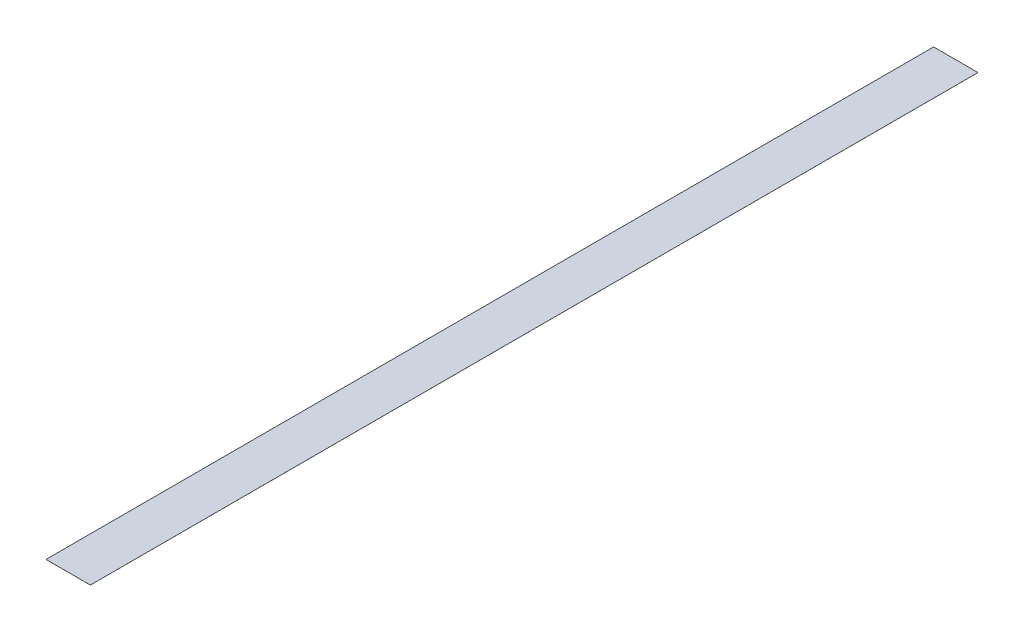
ISO-10303-21;
HEADER;
FILE_DESCRIPTION(('STEP AP214'),'2;1');
FILE_NAME('part.step','',(''),(''),'','','');
FILE_SCHEMA(('AUTOMOTIVE_DESIGN { 1 0 10303 214 1 1 1 1 }'));
ENDSEC;
DATA;
#1=APPLICATION_CONTEXT('core data for automotive mechanical design processes');
#2=APPLICATION_PROTOCOL_DEFINITION('international standard','automotive_design',2000,#1);
#3=PRODUCT_CONTEXT('',#1,'mechanical');
#4=PRODUCT('Part','Part','',(#3));
#5=PRODUCT_RELATED_PRODUCT_CATEGORY('part','',(#4));
#6=PRODUCT_DEFINITION_FORMATION('','',#4);
#7=PRODUCT_DEFINITION_CONTEXT('part definition',#1,'design');
#8=PRODUCT_DEFINITION('design','',#6,#7);
#9=PRODUCT_DEFINITION_SHAPE('','',#8);
#10=(LENGTH_UNIT() NAMED_UNIT(*) SI_UNIT(.MILLI.,.METRE.));
#11=(NAMED_UNIT(*) PLANE_ANGLE_UNIT() SI_UNIT($,.RADIAN.));
#12=(NAMED_UNIT(*) SI_UNIT($,.STERADIAN.) SOLID_ANGLE_UNIT());
#13=UNCERTAINTY_MEASURE_WITH_UNIT(LENGTH_MEASURE(1.E-05),#10,'distance_accuracy_value','');
#14=(GEOMETRIC_REPRESENTATION_CONTEXT(3) GLOBAL_UNCERTAINTY_ASSIGNED_CONTEXT((#13)) GLOBAL_UNIT_ASSIGNED_CONTEXT((#10,
#11,#12)) REPRESENTATION_CONTEXT('',''));
#15=CARTESIAN_POINT('',(0.,0.,0.));
#16=DIRECTION('',(0.,0.,1.));
#17=DIRECTION('',(1.,0.,0.));
#18=AXIS2_PLACEMENT_3D('',#15,#16,#17);
#19=CARTESIAN_POINT('',(382.129450549033,0.01,-902.602186167723));
#20=DIRECTION('',(0.,0.,-1.));
#21=DIRECTION('',(-1.,0.,0.));
#22=AXIS2_PLACEMENT_3D('',#19,#20,#21);
#23=PLANE('',#22);
#24=DIRECTION('',(1.,0.,0.));
#25=VECTOR('',#24,1.);
#26=CARTESIAN_POINT('',(382.129450549033,0.,-902.602186167723));
#27=LINE('',#26,#25);
#28=CARTESIAN_POINT('',(382.129450549033,0.,-902.602186167723));
#29=VERTEX_POINT('',#28);
#30=CARTESIAN_POINT('',(402.129450549032,0.,-902.602186167723));
#31=VERTEX_POINT('',#30);
#32=EDGE_CURVE('E110',#29,#31,#27,.T.);
#33=ORIENTED_EDGE('',*,*,#32,.F.);
#34=DIRECTION('',(0.,-1.,0.));
#35=VECTOR('',#34,1.);
#36=CARTESIAN_POINT('',(382.129450549033,0.01,-902.602186167723));
#37=LINE('',#36,#35);
#38=CARTESIAN_POINT('',(382.129450549033,0.01,-902.602186167723));
#39=VERTEX_POINT('',#38);
#40=EDGE_CURVE('E11',#39,#29,#37,.T.);
#41=ORIENTED_EDGE('',*,*,#40,.F.);
#42=DIRECTION('',(1.,0.,0.));
#43=VECTOR('',#42,1.);
#44=CARTESIAN_POINT('',(382.129450549033,0.01,-902.602186167723));
#45=LINE('',#44,#43);
#46=CARTESIAN_POINT('',(402.129450549032,0.01,-902.602186167723));
#47=VERTEX_POINT('',#46);
#48=EDGE_CURVE('E103',#39,#47,#45,.T.);
#49=ORIENTED_EDGE('',*,*,#48,.T.);
#50=DIRECTION('',(0.,-1.,0.));
#51=VECTOR('',#50,1.);
#52=CARTESIAN_POINT('',(402.129450549032,0.01,-902.602186167723));
#53=LINE('',#52,#51);
#54=EDGE_CURVE('E42',#47,#31,#53,.T.);
#55=ORIENTED_EDGE('',*,*,#54,.T.);
#56=EDGE_LOOP('',(#33,#41,#49,#55));
#57=FACE_BOUND('',#56,.T.);
#58=ADVANCED_FACE('F39',(#57),#23,.T.);
#59=CARTESIAN_POINT('',(382.129450549033,0.01,-902.602186167723));
#60=DIRECTION('',(1.,0.,0.));
#61=DIRECTION('',(0.,0.,-1.));
#62=AXIS2_PLACEMENT_3D('',#59,#60,#61);
#63=PLANE('',#62);
#64=DIRECTION('',(0.,0.,1.));
#65=VECTOR('',#64,1.);
#66=CARTESIAN_POINT('',(382.129450549033,0.,-902.602186167723));
#67=LINE('',#66,#65);
#68=CARTESIAN_POINT('',(382.129450549032,0.,-502.602186167723));
#69=VERTEX_POINT('',#68);
#70=EDGE_CURVE('E73',#29,#69,#67,.T.);
#71=ORIENTED_EDGE('',*,*,#70,.T.);
#72=DIRECTION('',(0.,-1.,0.));
#73=VECTOR('',#72,1.);
#74=CARTESIAN_POINT('',(382.129450549032,0.01,-502.602186167723));
#75=LINE('',#74,#73);
#76=CARTESIAN_POINT('',(382.129450549032,0.01,-502.602186167723));
#77=VERTEX_POINT('',#76);
#78=EDGE_CURVE('E49',#77,#69,#75,.T.);
#79=ORIENTED_EDGE('',*,*,#78,.F.);
#80=DIRECTION('',(0.,0.,1.));
#81=VECTOR('',#80,1.);
#82=CARTESIAN_POINT('',(382.129450549033,0.01,-902.602186167723));
#83=LINE('',#82,#81);
#84=EDGE_CURVE('E90',#39,#77,#83,.T.);
#85=ORIENTED_EDGE('',*,*,#84,.F.);
#86=ORIENTED_EDGE('',*,*,#40,.T.);
#87=EDGE_LOOP('',(#71,#79,#85,#86));
#88=FACE_BOUND('',#87,.T.);
#89=ADVANCED_FACE('F126',(#88),#63,.F.);
#90=CARTESIAN_POINT('',(382.129450549032,0.01,-502.602186167723));
#91=DIRECTION('',(0.,0.,-1.));
#92=DIRECTION('',(-1.,0.,0.));
#93=AXIS2_PLACEMENT_3D('',#90,#91,#92);
#94=PLANE('',#93);
#95=DIRECTION('',(1.,0.,0.));
#96=VECTOR('',#95,1.);
#97=CARTESIAN_POINT('',(382.129450549032,0.,-502.602186167723));
#98=LINE('',#97,#96);
#99=CARTESIAN_POINT('',(402.129450549032,0.,-502.602186167723));
#100=VERTEX_POINT('',#99);
#101=EDGE_CURVE('E98',#69,#100,#98,.T.);
#102=ORIENTED_EDGE('',*,*,#101,.T.);
#103=DIRECTION('',(0.,-1.,0.));
#104=VECTOR('',#103,1.);
#105=CARTESIAN_POINT('',(402.129450549032,0.01,-502.602186167723));
#106=LINE('',#105,#104);
#107=CARTESIAN_POINT('',(402.129450549032,0.01,-502.602186167723));
#108=VERTEX_POINT('',#107);
#109=EDGE_CURVE('E95',#108,#100,#106,.T.);
#110=ORIENTED_EDGE('',*,*,#109,.F.);
#111=DIRECTION('',(1.,0.,0.));
#112=VECTOR('',#111,1.);
#113=CARTESIAN_POINT('',(382.129450549032,0.01,-502.602186167723));
#114=LINE('',#113,#112);
#115=EDGE_CURVE('E85',#77,#108,#114,.T.);
#116=ORIENTED_EDGE('',*,*,#115,.F.);
#117=ORIENTED_EDGE('',*,*,#78,.T.);
#118=EDGE_LOOP('',(#102,#110,#116,#117));
#119=FACE_BOUND('',#118,.T.);
#120=ADVANCED_FACE('F96',(#119),#94,.F.);
#121=CARTESIAN_POINT('',(402.129450549032,0.01,-902.602186167723));
#122=DIRECTION('',(1.,0.,0.));
#123=DIRECTION('',(0.,0.,-1.));
#124=AXIS2_PLACEMENT_3D('',#121,#122,#123);
#125=PLANE('',#124);
#126=DIRECTION('',(0.,0.,1.));
#127=VECTOR('',#126,1.);
#128=CARTESIAN_POINT('',(402.129450549032,0.,-902.602186167723));
#129=LINE('',#128,#127);
#130=EDGE_CURVE('E114',#31,#100,#129,.T.);
#131=ORIENTED_EDGE('',*,*,#130,.F.);
#132=ORIENTED_EDGE('',*,*,#54,.F.);
#133=DIRECTION('',(0.,0.,1.));
#134=VECTOR('',#133,1.);
#135=CARTESIAN_POINT('',(402.129450549032,0.01,-902.602186167723));
#136=LINE('',#135,#134);
#137=EDGE_CURVE('E89',#47,#108,#136,.T.);
#138=ORIENTED_EDGE('',*,*,#137,.T.);
#139=ORIENTED_EDGE('',*,*,#109,.T.);
#140=EDGE_LOOP('',(#131,#132,#138,#139));
#141=FACE_BOUND('',#140,.T.);
#142=ADVANCED_FACE('F101',(#141),#125,.T.);
#143=CARTESIAN_POINT('',(0.,0.01,0.));
#144=DIRECTION('',(0.,-1.,0.));
#145=DIRECTION('',(0.,0.,-1.));
#146=AXIS2_PLACEMENT_3D('',#143,#144,#145);
#147=PLANE('',#146);
#148=ORIENTED_EDGE('',*,*,#48,.F.);
#149=ORIENTED_EDGE('',*,*,#84,.T.);
#150=ORIENTED_EDGE('',*,*,#115,.T.);
#151=ORIENTED_EDGE('',*,*,#137,.F.);
#152=EDGE_LOOP('',(#148,#149,#150,#151));
#153=FACE_BOUND('',#152,.T.);
#154=ADVANCED_FACE('F88',(#153),#147,.F.);
#155=CARTESIAN_POINT('',(0.,0.,0.));
#156=DIRECTION('',(0.,-1.,0.));
#157=DIRECTION('',(0.,0.,-1.));
#158=AXIS2_PLACEMENT_3D('',#155,#156,#157);
#159=PLANE('',#158);
#160=ORIENTED_EDGE('',*,*,#32,.T.);
#161=ORIENTED_EDGE('',*,*,#130,.T.);
#162=ORIENTED_EDGE('',*,*,#101,.F.);
#163=ORIENTED_EDGE('',*,*,#70,.F.);
#164=EDGE_LOOP('',(#160,#161,#162,#163));
#165=FACE_BOUND('',#164,.T.);
#166=ADVANCED_FACE('F123',(#165),#159,.T.);
#167=CLOSED_SHELL('',(#58,#89,#120,#142,#154,#166));
#168=MANIFOLD_SOLID_BREP('B2',#167);
#169=ADVANCED_BREP_SHAPE_REPRESENTATION('',(#18,#168),#14);
#170=SHAPE_DEFINITION_REPRESENTATION(#9,#169);
ENDSEC;
END-ISO-10303-21;
